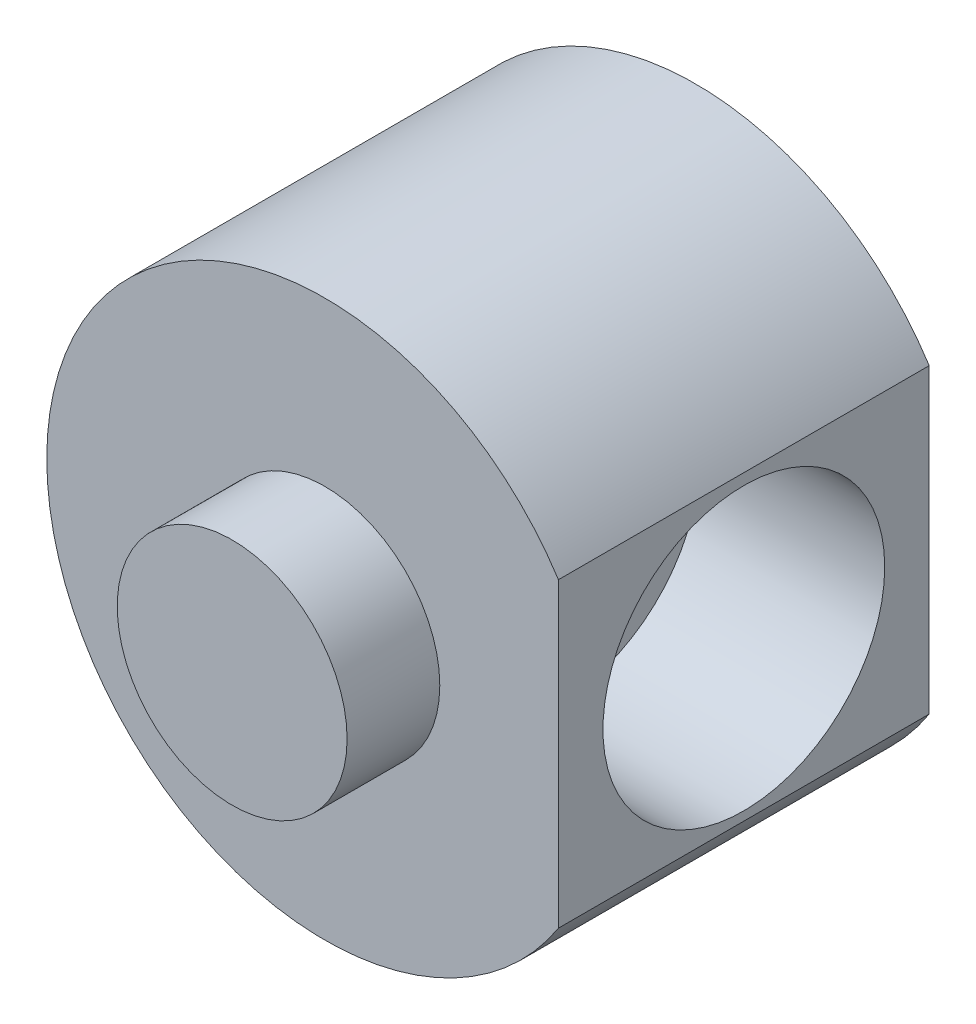
ISO-10303-21;
HEADER;
FILE_DESCRIPTION(('STEP AP214'),'2;1');
FILE_NAME('part.step','',(''),(''),'','','');
FILE_SCHEMA(('AUTOMOTIVE_DESIGN { 1 0 10303 214 1 1 1 1 }'));
ENDSEC;
DATA;
#1=APPLICATION_CONTEXT('core data for automotive mechanical design processes');
#2=APPLICATION_PROTOCOL_DEFINITION('international standard','automotive_design',2000,#1);
#3=PRODUCT_CONTEXT('',#1,'mechanical');
#4=PRODUCT('Part','Part','',(#3));
#5=PRODUCT_RELATED_PRODUCT_CATEGORY('part','',(#4));
#6=PRODUCT_DEFINITION_FORMATION('','',#4);
#7=PRODUCT_DEFINITION_CONTEXT('part definition',#1,'design');
#8=PRODUCT_DEFINITION('design','',#6,#7);
#9=PRODUCT_DEFINITION_SHAPE('','',#8);
#10=(LENGTH_UNIT() NAMED_UNIT(*) SI_UNIT(.MILLI.,.METRE.));
#11=(NAMED_UNIT(*) PLANE_ANGLE_UNIT() SI_UNIT($,.RADIAN.));
#12=(NAMED_UNIT(*) SI_UNIT($,.STERADIAN.) SOLID_ANGLE_UNIT());
#13=UNCERTAINTY_MEASURE_WITH_UNIT(LENGTH_MEASURE(1.E-05),#10,'distance_accuracy_value','');
#14=(GEOMETRIC_REPRESENTATION_CONTEXT(3) GLOBAL_UNCERTAINTY_ASSIGNED_CONTEXT((#13)) GLOBAL_UNIT_ASSIGNED_CONTEXT((#10,
#11,#12)) REPRESENTATION_CONTEXT('',''));
#15=CARTESIAN_POINT('',(0.,0.,0.));
#16=DIRECTION('',(0.,0.,1.));
#17=DIRECTION('',(1.,0.,0.));
#18=AXIS2_PLACEMENT_3D('',#15,#16,#17);
#19=CARTESIAN_POINT('',(-9.525,-0.0388645528585389,9.525));
#20=DIRECTION('',(1.,0.,0.));
#21=DIRECTION('',(0.,0.,-1.));
#22=AXIS2_PLACEMENT_3D('',#19,#20,#21);
#23=CYLINDRICAL_SURFACE('',#22,3.175);
#24=CARTESIAN_POINT('',(-9.525,0.,12.699762124401));
#25=CARTESIAN_POINT('',(-9.52500048353708,0.173328764424998,12.6976410481247));
#26=CARTESIAN_POINT('',(-9.52022525494723,0.346478549399185,12.6812777372123));
#27=CARTESIAN_POINT('',(-9.50170260785777,0.687330132003935,12.620680655949));
#28=CARTESIAN_POINT('',(-9.48795416160529,0.855031303264223,12.5764436930927));
#29=CARTESIAN_POINT('',(-9.45303351353589,1.18003279144155,12.4617617926243));
#30=CARTESIAN_POINT('',(-9.43187383069683,1.33735011935815,12.3913610384257));
#31=CARTESIAN_POINT('',(-9.38434144025201,1.63797219803955,12.2265269825531));
#32=CARTESIAN_POINT('',(-9.3579677136356,1.78127420151285,12.1320889821027));
#33=CARTESIAN_POINT('',(-9.30181361437683,2.05474982975029,11.9184174731225));
#34=CARTESIAN_POINT('',(-9.27195259844459,2.1843739874123,11.7985019612455));
#35=CARTESIAN_POINT('',(-9.21271926974921,2.42207865408445,11.5387980472234));
#36=CARTESIAN_POINT('',(-9.18334705931764,2.53015470272531,11.3990055408607));
#37=CARTESIAN_POINT('',(-9.12759948019633,2.72453327738843,11.0988706286529));
#38=CARTESIAN_POINT('',(-9.1013267340128,2.81016735130107,10.9380744470735));
#39=CARTESIAN_POINT('',(-9.05601681798254,2.95293729498465,10.6033430405463));
#40=CARTESIAN_POINT('',(-9.03697738344371,3.01008208627512,10.4294119485133));
#41=CARTESIAN_POINT('',(-9.0091747308314,3.09228588185211,10.0796768017752));
#42=CARTESIAN_POINT('',(-9.0000801257042,3.11838231969601,9.90414364216935));
#43=CARTESIAN_POINT('',(-8.99223013025336,3.14095244076945,9.55097555846527));
#44=CARTESIAN_POINT('',(-8.99347180027725,3.13743454635721,9.37334124628851));
#45=CARTESIAN_POINT('',(-9.00583847013524,3.10174274998413,9.02916334338856));
#46=CARTESIAN_POINT('',(-9.01653329376175,3.07081595903667,8.86247252629013));
#47=CARTESIAN_POINT('',(-9.04591811963104,2.98313721207557,8.53677841386118));
#48=CARTESIAN_POINT('',(-9.06460914589305,2.92638194832587,8.37777610604947));
#49=CARTESIAN_POINT('',(-9.10825668530382,2.78758761563814,8.06862326791974));
#50=CARTESIAN_POINT('',(-9.13332142116096,2.70510559269194,7.91868751029285));
#51=CARTESIAN_POINT('',(-9.18679464357426,2.51752280354533,7.63435518925058));
#52=CARTESIAN_POINT('',(-9.21520408806972,2.41241555020438,7.4999630995644));
#53=CARTESIAN_POINT('',(-9.27388601755478,2.17627490197497,7.2434022910408));
#54=CARTESIAN_POINT('',(-9.3041800348287,2.04419876943175,7.12219614544813));
#55=CARTESIAN_POINT('',(-9.36188237292784,1.76114145016841,6.9034359724438));
#56=CARTESIAN_POINT('',(-9.38929049751902,1.61015897938714,6.80588355284408));
#57=CARTESIAN_POINT('',(-9.43833148382869,1.29210756730392,6.63678847236904));
#58=CARTESIAN_POINT('',(-9.45992679836122,1.12494309949013,6.56541387949913));
#59=CARTESIAN_POINT('',(-9.49458000390573,0.780095464285093,6.45207980984746));
#60=CARTESIAN_POINT('',(-9.50764089585882,0.602416018246157,6.41010999315072));
#61=CARTESIAN_POINT('',(-9.52327989774283,0.250001621313294,6.35837818689041));
#62=CARTESIAN_POINT('',(-9.5262945928306,0.0754819557249763,6.34727838596963));
#63=CARTESIAN_POINT('',(-9.52268247417854,-0.272897012553204,6.35384964524686));
#64=CARTESIAN_POINT('',(-9.51605708586739,-0.446756409062629,6.37151645192313));
#65=CARTESIAN_POINT('',(-9.4941313254275,-0.784200334836202,6.43407920846363));
#66=CARTESIAN_POINT('',(-9.47906077763014,-0.94793445369163,6.4782558945151));
#67=CARTESIAN_POINT('',(-9.44190001152555,-1.2656018178172,6.59170834020304));
#68=CARTESIAN_POINT('',(-9.41980880369699,-1.41953367784243,6.66098763810013));
#69=CARTESIAN_POINT('',(-9.37000492498034,-1.71820755974666,6.82494460459517));
#70=CARTESIAN_POINT('',(-9.34214698614054,-1.86255017001919,6.92030462372474));
#71=CARTESIAN_POINT('',(-9.28399477813875,-2.13361586738125,7.13286117616397));
#72=CARTESIAN_POINT('',(-9.25369975107988,-2.26033343966116,7.25006451744721));
#73=CARTESIAN_POINT('',(-9.19233877692692,-2.49846825952034,7.50923407906776));
#74=CARTESIAN_POINT('',(-9.16129948166582,-2.60894044669301,7.65207726170169));
#75=CARTESIAN_POINT('',(-9.1033670036057,-2.80441878596728,7.95502408327116));
#76=CARTESIAN_POINT('',(-9.07647372591876,-2.88942552092647,8.11512732704142));
#77=CARTESIAN_POINT('',(-9.03023108284198,-3.03085662924995,8.44748948930054));
#78=CARTESIAN_POINT('',(-9.01084041639212,-3.08743801091077,8.61967551056505));
#79=CARTESIAN_POINT('',(-8.98193879835442,-3.17054857344907,8.9719289574489));
#80=CARTESIAN_POINT('',(-8.97242329060323,-3.19709161381462,9.1519927084714));
#81=CARTESIAN_POINT('',(-8.96478346355292,-3.21844544156607,9.50458384469994));
#82=CARTESIAN_POINT('',(-8.96608008934379,-3.21486919159918,9.67700256909369));
#83=CARTESIAN_POINT('',(-8.97852220808099,-3.17995280654103,10.0186268824913));
#84=CARTESIAN_POINT('',(-8.98966728536818,-3.14861384318977,10.1878326067937));
#85=CARTESIAN_POINT('',(-9.02017036317905,-3.0601098284122,10.5154711036969));
#86=CARTESIAN_POINT('',(-9.03938861499239,-3.00338319962206,10.6740362867359));
#87=CARTESIAN_POINT('',(-9.0838624153554,-2.86605221578484,10.9795454826003));
#88=CARTESIAN_POINT('',(-9.10911935745164,-2.78544234818197,11.1264868025585));
#89=CARTESIAN_POINT('',(-9.16430149958418,-2.59829307433951,11.4119019463236));
#90=CARTESIAN_POINT('',(-9.19438826398816,-2.49072936056439,11.5496728175362));
#91=CARTESIAN_POINT('',(-9.25512963733203,-2.25456190530622,11.8057149104586));
#92=CARTESIAN_POINT('',(-9.2857844050412,-2.12595219986969,11.9239805857118));
#93=CARTESIAN_POINT('',(-9.34566651470987,-1.84539056158885,12.1422248278483));
#94=CARTESIAN_POINT('',(-9.37479344601166,-1.69273052534724,12.2413239207235));
#95=CARTESIAN_POINT('',(-9.42707746473585,-1.3719310042719,12.4123119264288));
#96=CARTESIAN_POINT('',(-9.45023618976779,-1.20379578287841,12.4842083059218));
#97=CARTESIAN_POINT('',(-9.4870934481825,-0.865048227841246,12.5955542763872));
#98=CARTESIAN_POINT('',(-9.50118913934755,-0.69493304060115,12.6363830519777));
#99=CARTESIAN_POINT('',(-9.52014092426639,-0.349816991954791,12.6895527776123));
#100=CARTESIAN_POINT('',(-9.52499951230988,-0.174817462419455,12.7019014183228));
#101=CARTESIAN_POINT('',(-9.525,0.,12.699762124401));
#102=B_SPLINE_CURVE_WITH_KNOTS('',3,(#24,#25,#26,#27,#28,#29,#30,#31,#32,#33,#34,#35,#36,#37,
#38,#39,#40,#41,#42,#43,#44,#45,#46,#47,#48,#49,#50,#51,#52,#53,#54,#55,#56,#57,#58,#59,#60,#61,
#62,#63,#64,#65,#66,#67,#68,#69,#70,#71,#72,#73,#74,#75,#76,#77,#78,#79,#80,#81,#82,#83,#84,#85,
#86,#87,#88,#89,#90,#91,#92,#93,#94,#95,#96,#97,#98,#99,#100,#101),.UNSPECIFIED.,.T.,.F.,(4,2,2,
2,2,2,2,2,2,2,2,2,2,2,2,2,2,2,2,2,2,2,2,2,2,2,2,2,2,2,2,2,2,2,2,2,2,2,4),(0.,0.519380984952388,
1.03882146795931,1.55738871623646,2.0760574114681,2.61091716522112,3.14588751804565,
3.69533654284353,4.24461339748963,4.77496965922476,5.30517509198186,5.81242793470966,
6.31974575731055,6.83633147635244,7.35306550939813,7.89594585528144,8.43886309196868,
8.98520737748506,9.53135944958049,10.0534440420199,10.5754514443876,11.0838984616721,
11.5924171734223,12.1157795925491,12.6393054032235,13.1863887522712,13.7334595786255,
14.2774744728184,14.8212382597417,15.336075130596,15.8508902735229,16.3571389097622,
16.8635044857859,17.3932208710482,17.9230876266113,18.4733565934414,19.0234744114286,
19.5474578024953,20.0712996825173),.UNSPECIFIED.);
#103=CARTESIAN_POINT('',(-9.525,0.,12.699762124401));
#104=VERTEX_POINT('',#103);
#105=EDGE_CURVE('E87',#104,#104,#102,.T.);
#106=ORIENTED_EDGE('',*,*,#105,.T.);
#107=EDGE_LOOP('',(#106));
#108=FACE_BOUND('',#107,.T.);
#109=CARTESIAN_POINT('',(1.651,-0.0388645528585389,9.525));
#110=DIRECTION('',(1.,0.,0.));
#111=DIRECTION('',(0.,0.,-1.));
#112=AXIS2_PLACEMENT_3D('',#109,#110,#111);
#113=CIRCLE('',#112,3.175);
#114=CARTESIAN_POINT('',(1.651,-0.0388645528585389,6.35));
#115=VERTEX_POINT('',#114);
#116=EDGE_CURVE('E136',#115,#115,#113,.T.);
#117=ORIENTED_EDGE('',*,*,#116,.T.);
#118=EDGE_LOOP('',(#117));
#119=FACE_BOUND('',#118,.T.);
#120=ADVANCED_FACE('F34',(#108,#119),#23,.F.);
#121=CARTESIAN_POINT('',(0.,0.,0.));
#122=DIRECTION('',(0.,0.,-1.));
#123=DIRECTION('',(-1.,0.,0.));
#124=AXIS2_PLACEMENT_3D('',#121,#122,#123);
#125=PLANE('',#124);
#126=CARTESIAN_POINT('',(0.,0.,0.));
#127=DIRECTION('',(0.,0.,1.));
#128=DIRECTION('',(1.,0.,0.));
#129=AXIS2_PLACEMENT_3D('',#126,#127,#128);
#130=CIRCLE('',#129,3.937);
#131=CARTESIAN_POINT('',(3.937,0.,0.));
#132=VERTEX_POINT('',#131);
#133=EDGE_CURVE('E11',#132,#132,#130,.T.);
#134=ORIENTED_EDGE('',*,*,#133,.F.);
#135=EDGE_LOOP('',(#134));
#136=FACE_BOUND('',#135,.T.);
#137=ADVANCED_FACE('F36',(#136),#125,.T.);
#138=CARTESIAN_POINT('',(0.,0.,19.05));
#139=DIRECTION('',(0.,0.,1.));
#140=DIRECTION('',(1.,0.,0.));
#141=AXIS2_PLACEMENT_3D('',#138,#139,#140);
#142=CYLINDRICAL_SURFACE('',#141,3.937);
#143=ORIENTED_EDGE('',*,*,#133,.T.);
#144=EDGE_LOOP('',(#143));
#145=FACE_BOUND('',#144,.T.);
#146=CARTESIAN_POINT('',(0.,0.,3.175));
#147=DIRECTION('',(0.,0.,1.));
#148=DIRECTION('',(1.,0.,0.));
#149=AXIS2_PLACEMENT_3D('',#146,#147,#148);
#150=CIRCLE('',#149,3.937);
#151=CARTESIAN_POINT('',(3.937,0.,3.175));
#152=VERTEX_POINT('',#151);
#153=EDGE_CURVE('E42',#152,#152,#150,.T.);
#154=ORIENTED_EDGE('',*,*,#153,.F.);
#155=EDGE_LOOP('',(#154));
#156=FACE_BOUND('',#155,.T.);
#157=ADVANCED_FACE('F131',(#145,#156),#142,.T.);
#158=CARTESIAN_POINT('',(3.937,0.,3.175));
#159=DIRECTION('',(0.,0.,-1.));
#160=DIRECTION('',(-1.,0.,0.));
#161=AXIS2_PLACEMENT_3D('',#158,#159,#160);
#162=PLANE('',#161);
#163=DIRECTION('',(0.,-1.,0.));
#164=VECTOR('',#163,1.);
#165=CARTESIAN_POINT('',(8.001,0.,3.175));
#166=LINE('',#165,#164);
#167=CARTESIAN_POINT('',(8.001,5.16813544714146,3.175));
#168=VERTEX_POINT('',#167);
#169=CARTESIAN_POINT('',(8.001,-5.16813544714146,3.175));
#170=VERTEX_POINT('',#169);
#171=EDGE_CURVE('E59',#168,#170,#166,.T.);
#172=ORIENTED_EDGE('',*,*,#171,.T.);
#173=CARTESIAN_POINT('',(0.,0.,3.175));
#174=DIRECTION('',(0.,0.,1.));
#175=DIRECTION('',(1.,0.,0.));
#176=AXIS2_PLACEMENT_3D('',#173,#174,#175);
#177=CIRCLE('',#176,9.525);
#178=EDGE_CURVE('E69',#168,#170,#177,.T.);
#179=ORIENTED_EDGE('',*,*,#178,.F.);
#180=EDGE_LOOP('',(#172,#179));
#181=FACE_BOUND('',#180,.T.);
#182=ORIENTED_EDGE('',*,*,#153,.T.);
#183=EDGE_LOOP('',(#182));
#184=FACE_BOUND('',#183,.T.);
#185=ADVANCED_FACE('F73',(#181,#184),#162,.T.);
#186=CARTESIAN_POINT('',(0.,0.,19.05));
#187=DIRECTION('',(0.,0.,1.));
#188=DIRECTION('',(1.,0.,0.));
#189=AXIS2_PLACEMENT_3D('',#186,#187,#188);
#190=CYLINDRICAL_SURFACE('',#189,9.525);
#191=ORIENTED_EDGE('',*,*,#105,.F.);
#192=EDGE_LOOP('',(#191));
#193=FACE_BOUND('',#192,.T.);
#194=DIRECTION('',(0.,0.,1.));
#195=VECTOR('',#194,1.);
#196=CARTESIAN_POINT('',(8.001,-5.16813544714146,-7.2730176110112));
#197=LINE('',#196,#195);
#198=CARTESIAN_POINT('',(8.001,-5.16813544714146,15.875));
#199=VERTEX_POINT('',#198);
#200=EDGE_CURVE('E61',#170,#199,#197,.T.);
#201=ORIENTED_EDGE('',*,*,#200,.T.);
#202=CARTESIAN_POINT('',(0.,0.,15.875));
#203=DIRECTION('',(0.,0.,1.));
#204=DIRECTION('',(1.,0.,0.));
#205=AXIS2_PLACEMENT_3D('',#202,#203,#204);
#206=CIRCLE('',#205,9.525);
#207=CARTESIAN_POINT('',(8.001,5.16813544714146,15.875));
#208=VERTEX_POINT('',#207);
#209=EDGE_CURVE('E71',#208,#199,#206,.T.);
#210=ORIENTED_EDGE('',*,*,#209,.F.);
#211=DIRECTION('',(0.,0.,1.));
#212=VECTOR('',#211,1.);
#213=CARTESIAN_POINT('',(8.001,5.16813544714146,-7.2730176110112));
#214=LINE('',#213,#212);
#215=EDGE_CURVE('E49',#168,#208,#214,.T.);
#216=ORIENTED_EDGE('',*,*,#215,.F.);
#217=ORIENTED_EDGE('',*,*,#178,.T.);
#218=EDGE_LOOP('',(#201,#210,#216,#217));
#219=FACE_BOUND('',#218,.T.);
#220=ADVANCED_FACE('F68',(#193,#219),#190,.T.);
#221=CARTESIAN_POINT('',(9.525,0.,15.875));
#222=DIRECTION('',(0.,0.,1.));
#223=DIRECTION('',(1.,0.,0.));
#224=AXIS2_PLACEMENT_3D('',#221,#222,#223);
#225=PLANE('',#224);
#226=DIRECTION('',(0.,-1.,0.));
#227=VECTOR('',#226,1.);
#228=CARTESIAN_POINT('',(8.001,0.,15.875));
#229=LINE('',#228,#227);
#230=EDGE_CURVE('E54',#208,#199,#229,.T.);
#231=ORIENTED_EDGE('',*,*,#230,.F.);
#232=ORIENTED_EDGE('',*,*,#209,.T.);
#233=EDGE_LOOP('',(#231,#232));
#234=FACE_BOUND('',#233,.T.);
#235=CARTESIAN_POINT('',(0.,0.,15.875));
#236=DIRECTION('',(0.,0.,1.));
#237=DIRECTION('',(1.,0.,0.));
#238=AXIS2_PLACEMENT_3D('',#235,#236,#237);
#239=CIRCLE('',#238,3.937);
#240=CARTESIAN_POINT('',(3.937,0.,15.875));
#241=VERTEX_POINT('',#240);
#242=EDGE_CURVE('E77',#241,#241,#239,.T.);
#243=ORIENTED_EDGE('',*,*,#242,.F.);
#244=EDGE_LOOP('',(#243));
#245=FACE_BOUND('',#244,.T.);
#246=ADVANCED_FACE('F116',(#234,#245),#225,.T.);
#247=CARTESIAN_POINT('',(0.,0.,19.05));
#248=DIRECTION('',(0.,0.,1.));
#249=DIRECTION('',(1.,0.,0.));
#250=AXIS2_PLACEMENT_3D('',#247,#248,#249);
#251=CYLINDRICAL_SURFACE('',#250,3.937);
#252=ORIENTED_EDGE('',*,*,#242,.T.);
#253=EDGE_LOOP('',(#252));
#254=FACE_BOUND('',#253,.T.);
#255=CARTESIAN_POINT('',(0.,0.,19.05));
#256=DIRECTION('',(0.,0.,1.));
#257=DIRECTION('',(1.,0.,0.));
#258=AXIS2_PLACEMENT_3D('',#255,#256,#257);
#259=CIRCLE('',#258,3.937);
#260=CARTESIAN_POINT('',(3.937,0.,19.05));
#261=VERTEX_POINT('',#260);
#262=EDGE_CURVE('E82',#261,#261,#259,.T.);
#263=ORIENTED_EDGE('',*,*,#262,.F.);
#264=EDGE_LOOP('',(#263));
#265=FACE_BOUND('',#264,.T.);
#266=ADVANCED_FACE('F113',(#254,#265),#251,.T.);
#267=CARTESIAN_POINT('',(3.937,0.,19.05));
#268=DIRECTION('',(0.,0.,1.));
#269=DIRECTION('',(1.,0.,0.));
#270=AXIS2_PLACEMENT_3D('',#267,#268,#269);
#271=PLANE('',#270);
#272=ORIENTED_EDGE('',*,*,#262,.T.);
#273=EDGE_LOOP('',(#272));
#274=FACE_BOUND('',#273,.T.);
#275=ADVANCED_FACE('F109',(#274),#271,.T.);
#276=CARTESIAN_POINT('',(8.001,0.,-7.2730176110112));
#277=DIRECTION('',(-1.,0.,0.));
#278=DIRECTION('',(0.,0.,1.));
#279=AXIS2_PLACEMENT_3D('',#276,#277,#278);
#280=PLANE('',#279);
#281=CARTESIAN_POINT('',(8.001,-0.0388645528585389,9.525));
#282=DIRECTION('',(1.,0.,0.));
#283=DIRECTION('',(0.,0.,-1.));
#284=AXIS2_PLACEMENT_3D('',#281,#282,#283);
#285=CIRCLE('',#284,4.826);
#286=CARTESIAN_POINT('',(8.001,-0.0388645528585389,4.699));
#287=VERTEX_POINT('',#286);
#288=EDGE_CURVE('E95',#287,#287,#285,.T.);
#289=ORIENTED_EDGE('',*,*,#288,.F.);
#290=EDGE_LOOP('',(#289));
#291=FACE_BOUND('',#290,.T.);
#292=ORIENTED_EDGE('',*,*,#215,.T.);
#293=ORIENTED_EDGE('',*,*,#230,.T.);
#294=ORIENTED_EDGE('',*,*,#200,.F.);
#295=ORIENTED_EDGE('',*,*,#171,.F.);
#296=EDGE_LOOP('',(#292,#293,#294,#295));
#297=FACE_BOUND('',#296,.T.);
#298=ADVANCED_FACE('F60',(#291,#297),#280,.F.);
#299=CARTESIAN_POINT('',(1.651,-0.0388645528585389,9.525));
#300=DIRECTION('',(1.,0.,0.));
#301=DIRECTION('',(0.,0.,-1.));
#302=AXIS2_PLACEMENT_3D('',#299,#300,#301);
#303=CYLINDRICAL_SURFACE('',#302,4.826);
#304=CARTESIAN_POINT('',(1.651,-0.0388645528585389,9.525));
#305=DIRECTION('',(1.,0.,0.));
#306=DIRECTION('',(0.,0.,-1.));
#307=AXIS2_PLACEMENT_3D('',#304,#305,#306);
#308=CIRCLE('',#307,4.826);
#309=CARTESIAN_POINT('',(1.651,-0.0388645528585389,4.699));
#310=VERTEX_POINT('',#309);
#311=EDGE_CURVE('E94',#310,#310,#308,.T.);
#312=ORIENTED_EDGE('',*,*,#311,.F.);
#313=EDGE_LOOP('',(#312));
#314=FACE_BOUND('',#313,.T.);
#315=ORIENTED_EDGE('',*,*,#288,.T.);
#316=EDGE_LOOP('',(#315));
#317=FACE_BOUND('',#316,.T.);
#318=ADVANCED_FACE('F105',(#314,#317),#303,.F.);
#319=CARTESIAN_POINT('',(1.651,0.,0.));
#320=DIRECTION('',(1.,0.,0.));
#321=DIRECTION('',(0.,0.,-1.));
#322=AXIS2_PLACEMENT_3D('',#319,#320,#321);
#323=PLANE('',#322);
#324=ORIENTED_EDGE('',*,*,#116,.F.);
#325=EDGE_LOOP('',(#324));
#326=FACE_BOUND('',#325,.T.);
#327=ORIENTED_EDGE('',*,*,#311,.T.);
#328=EDGE_LOOP('',(#327));
#329=FACE_BOUND('',#328,.T.);
#330=ADVANCED_FACE('F144',(#326,#329),#323,.T.);
#331=CLOSED_SHELL('',(#120,#137,#157,#185,#220,#246,#266,#275,#298,#318,#330));
#332=MANIFOLD_SOLID_BREP('B2',#331);
#333=ADVANCED_BREP_SHAPE_REPRESENTATION('',(#18,#332),#14);
#334=SHAPE_DEFINITION_REPRESENTATION(#9,#333);
ENDSEC;
END-ISO-10303-21;
